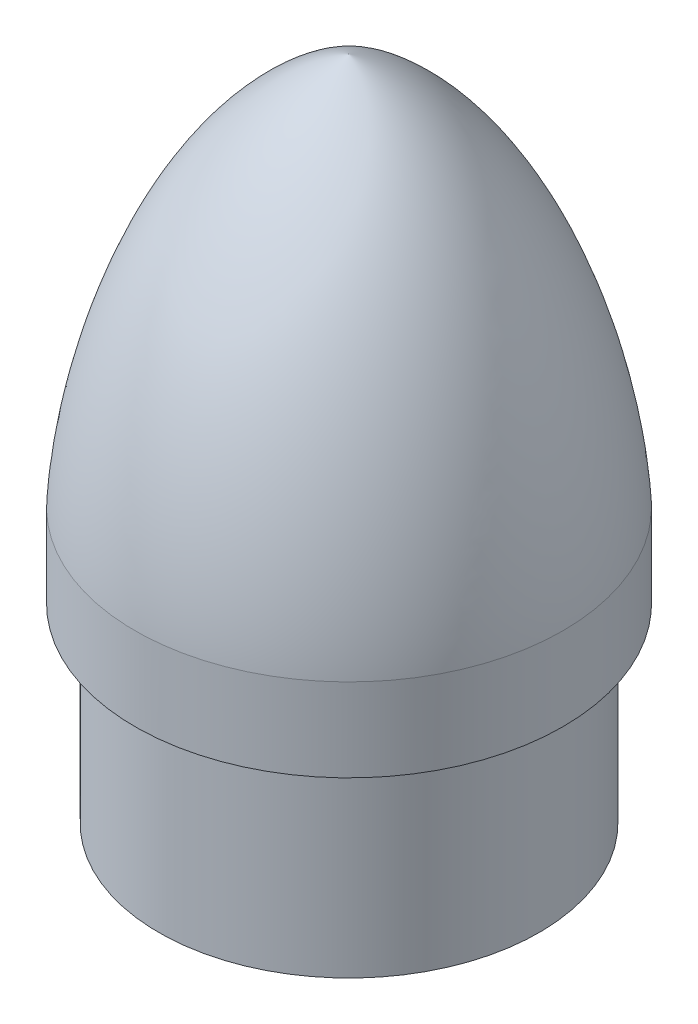
ISO-10303-21;
HEADER;
FILE_DESCRIPTION(('STEP AP214'),'2;1');
FILE_NAME('part.step','',(''),(''),'','','');
FILE_SCHEMA(('AUTOMOTIVE_DESIGN { 1 0 10303 214 1 1 1 1 }'));
ENDSEC;
DATA;
#1=APPLICATION_CONTEXT('core data for automotive mechanical design processes');
#2=APPLICATION_PROTOCOL_DEFINITION('international standard','automotive_design',2000,#1);
#3=PRODUCT_CONTEXT('',#1,'mechanical');
#4=PRODUCT('Part','Part','',(#3));
#5=PRODUCT_RELATED_PRODUCT_CATEGORY('part','',(#4));
#6=PRODUCT_DEFINITION_FORMATION('','',#4);
#7=PRODUCT_DEFINITION_CONTEXT('part definition',#1,'design');
#8=PRODUCT_DEFINITION('design','',#6,#7);
#9=PRODUCT_DEFINITION_SHAPE('','',#8);
#10=(LENGTH_UNIT() NAMED_UNIT(*) SI_UNIT(.MILLI.,.METRE.));
#11=(NAMED_UNIT(*) PLANE_ANGLE_UNIT() SI_UNIT($,.RADIAN.));
#12=(NAMED_UNIT(*) SI_UNIT($,.STERADIAN.) SOLID_ANGLE_UNIT());
#13=UNCERTAINTY_MEASURE_WITH_UNIT(LENGTH_MEASURE(1.E-05),#10,'distance_accuracy_value','');
#14=(GEOMETRIC_REPRESENTATION_CONTEXT(3) GLOBAL_UNCERTAINTY_ASSIGNED_CONTEXT((#13)) GLOBAL_UNIT_ASSIGNED_CONTEXT((#10,
#11,#12)) REPRESENTATION_CONTEXT('',''));
#15=CARTESIAN_POINT('',(0.,0.,0.));
#16=DIRECTION('',(0.,0.,1.));
#17=DIRECTION('',(1.,0.,0.));
#18=AXIS2_PLACEMENT_3D('',#15,#16,#17);
#19=CARTESIAN_POINT('',(-45.,0.,0.));
#20=CARTESIAN_POINT('',(-45.1998705378717,9.06996798734469,0.));
#21=CARTESIAN_POINT('',(-45.6869403041624,37.0783886423568,0.));
#22=CARTESIAN_POINT('',(-29.5108115453069,88.1319656076667,0.));
#23=CARTESIAN_POINT('',(0.,100.,0.));
#24=B_SPLINE_CURVE_WITH_KNOTS('',3,(#19,#20,#21,#22,#23),.UNSPECIFIED.,.F.,.F.,(4,1,4),(0.,
0.165319882275896,1.),.UNSPECIFIED.);
#25=CARTESIAN_POINT('',(0.,100.,0.));
#26=DIRECTION('',(0.,-1.,0.));
#27=AXIS1_PLACEMENT('',#25,#26);
#28=SURFACE_OF_REVOLUTION('',#24,#27);
#29=CARTESIAN_POINT('',(0.,17.4794198064871,0.));
#30=DIRECTION('',(0.,-1.,0.));
#31=DIRECTION('',(1.,0.,0.));
#32=AXIS2_PLACEMENT_3D('',#29,#30,#31);
#33=CIRCLE('',#32,45.0000000000002);
#34=CARTESIAN_POINT('',(45.0000000000002,17.4794198064871,0.));
#35=VERTEX_POINT('',#34);
#36=EDGE_CURVE('E67',#35,#35,#33,.T.);
#37=ORIENTED_EDGE('',*,*,#36,.F.);
#38=EDGE_LOOP('',(#37));
#39=FACE_BOUND('',#38,.T.);
#40=CARTESIAN_POINT('',(0.,100.,0.));
#41=VERTEX_POINT('',#40);
#42=VERTEX_LOOP('',#41);
#43=FACE_BOUND('',#42,.T.);
#44=ADVANCED_FACE('F63',(#39,#43),#28,.F.);
#45=CARTESIAN_POINT('',(0.,100.,0.));
#46=DIRECTION('',(0.,-1.,0.));
#47=DIRECTION('',(0.,0.,-1.));
#48=AXIS2_PLACEMENT_3D('',#45,#46,#47);
#49=CYLINDRICAL_SURFACE('',#48,45.);
#50=ORIENTED_EDGE('',*,*,#36,.T.);
#51=EDGE_LOOP('',(#50));
#52=FACE_BOUND('',#51,.T.);
#53=CARTESIAN_POINT('',(0.,0.,0.));
#54=DIRECTION('',(0.,-1.,0.));
#55=DIRECTION('',(1.,0.,0.));
#56=AXIS2_PLACEMENT_3D('',#53,#54,#55);
#57=CIRCLE('',#56,45.0000000000001);
#58=CARTESIAN_POINT('',(45.0000000000001,0.,0.));
#59=VERTEX_POINT('',#58);
#60=EDGE_CURVE('E92',#59,#59,#57,.T.);
#61=ORIENTED_EDGE('',*,*,#60,.F.);
#62=EDGE_LOOP('',(#61));
#63=FACE_BOUND('',#62,.T.);
#64=ADVANCED_FACE('F65',(#52,#63),#49,.T.);
#65=CARTESIAN_POINT('',(0.,0.,0.));
#66=DIRECTION('',(0.,1.,0.));
#67=DIRECTION('',(0.,0.,1.));
#68=AXIS2_PLACEMENT_3D('',#65,#66,#67);
#69=PLANE('',#68);
#70=CARTESIAN_POINT('',(0.,0.,0.));
#71=DIRECTION('',(0.,-1.,0.));
#72=DIRECTION('',(0.,0.,-1.));
#73=AXIS2_PLACEMENT_3D('',#70,#71,#72);
#74=CIRCLE('',#73,40.);
#75=CARTESIAN_POINT('',(0.,0.,-40.));
#76=VERTEX_POINT('',#75);
#77=EDGE_CURVE('E11',#76,#76,#74,.T.);
#78=ORIENTED_EDGE('',*,*,#77,.F.);
#79=EDGE_LOOP('',(#78));
#80=FACE_BOUND('',#79,.T.);
#81=ORIENTED_EDGE('',*,*,#60,.T.);
#82=EDGE_LOOP('',(#81));
#83=FACE_BOUND('',#82,.T.);
#84=ADVANCED_FACE('F81',(#80,#83),#69,.F.);
#85=CARTESIAN_POINT('',(0.,-40.,0.));
#86=DIRECTION('',(0.,1.,0.));
#87=DIRECTION('',(0.,0.,1.));
#88=AXIS2_PLACEMENT_3D('',#85,#86,#87);
#89=CYLINDRICAL_SURFACE('',#88,40.);
#90=CARTESIAN_POINT('',(0.,-40.,0.));
#91=DIRECTION('',(0.,-1.,0.));
#92=DIRECTION('',(0.,0.,-1.));
#93=AXIS2_PLACEMENT_3D('',#90,#91,#92);
#94=CIRCLE('',#93,40.);
#95=CARTESIAN_POINT('',(0.,-40.,-40.));
#96=VERTEX_POINT('',#95);
#97=EDGE_CURVE('E98',#96,#96,#94,.T.);
#98=ORIENTED_EDGE('',*,*,#97,.F.);
#99=EDGE_LOOP('',(#98));
#100=FACE_BOUND('',#99,.T.);
#101=ORIENTED_EDGE('',*,*,#77,.T.);
#102=EDGE_LOOP('',(#101));
#103=FACE_BOUND('',#102,.T.);
#104=ADVANCED_FACE('F86',(#100,#103),#89,.T.);
#105=CARTESIAN_POINT('',(0.,-40.,0.));
#106=DIRECTION('',(0.,-1.,0.));
#107=DIRECTION('',(0.,0.,-1.));
#108=AXIS2_PLACEMENT_3D('',#105,#106,#107);
#109=PLANE('',#108);
#110=ORIENTED_EDGE('',*,*,#97,.T.);
#111=EDGE_LOOP('',(#110));
#112=FACE_BOUND('',#111,.T.);
#113=ADVANCED_FACE('F107',(#112),#109,.T.);
#114=CLOSED_SHELL('',(#44,#64,#84,#104,#113));
#115=MANIFOLD_SOLID_BREP('B2',#114);
#116=ADVANCED_BREP_SHAPE_REPRESENTATION('',(#18,#115),#14);
#117=SHAPE_DEFINITION_REPRESENTATION(#9,#116);
ENDSEC;
END-ISO-10303-21;
